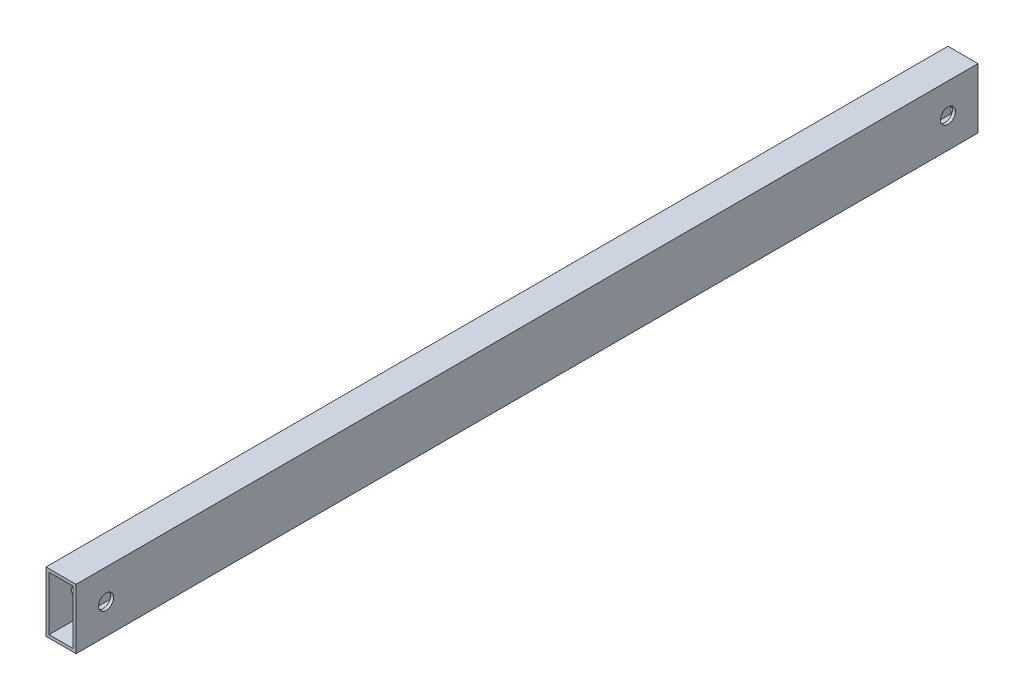
ISO-10303-21;
HEADER;
FILE_DESCRIPTION(('STEP AP214'),'2;1');
FILE_NAME('part.step','',(''),(''),'','','');
FILE_SCHEMA(('AUTOMOTIVE_DESIGN { 1 0 10303 214 1 1 1 1 }'));
ENDSEC;
DATA;
#1=APPLICATION_CONTEXT('core data for automotive mechanical design processes');
#2=APPLICATION_PROTOCOL_DEFINITION('international standard','automotive_design',2000,#1);
#3=PRODUCT_CONTEXT('',#1,'mechanical');
#4=PRODUCT('Part','Part','',(#3));
#5=PRODUCT_RELATED_PRODUCT_CATEGORY('part','',(#4));
#6=PRODUCT_DEFINITION_FORMATION('','',#4);
#7=PRODUCT_DEFINITION_CONTEXT('part definition',#1,'design');
#8=PRODUCT_DEFINITION('design','',#6,#7);
#9=PRODUCT_DEFINITION_SHAPE('','',#8);
#10=(LENGTH_UNIT() NAMED_UNIT(*) SI_UNIT(.MILLI.,.METRE.));
#11=(NAMED_UNIT(*) PLANE_ANGLE_UNIT() SI_UNIT($,.RADIAN.));
#12=(NAMED_UNIT(*) SI_UNIT($,.STERADIAN.) SOLID_ANGLE_UNIT());
#13=UNCERTAINTY_MEASURE_WITH_UNIT(LENGTH_MEASURE(1.E-05),#10,'distance_accuracy_value','');
#14=(GEOMETRIC_REPRESENTATION_CONTEXT(3) GLOBAL_UNCERTAINTY_ASSIGNED_CONTEXT((#13)) GLOBAL_UNIT_ASSIGNED_CONTEXT((#10,
#11,#12)) REPRESENTATION_CONTEXT('',''));
#15=CARTESIAN_POINT('',(0.,0.,0.));
#16=DIRECTION('',(0.,0.,1.));
#17=DIRECTION('',(1.,0.,0.));
#18=AXIS2_PLACEMENT_3D('',#15,#16,#17);
#19=CARTESIAN_POINT('',(0.,0.,300.));
#20=DIRECTION('',(0.,0.,-1.));
#21=DIRECTION('',(-1.,0.,0.));
#22=AXIS2_PLACEMENT_3D('',#19,#20,#21);
#23=PLANE('',#22);
#24=DIRECTION('',(0.,1.,0.));
#25=VECTOR('',#24,1.);
#26=CARTESIAN_POINT('',(5.00000000000001,-9.99999999999999,300.));
#27=LINE('',#26,#25);
#28=CARTESIAN_POINT('',(5.00000000000001,-9.99999999999999,300.));
#29=VERTEX_POINT('',#28);
#30=CARTESIAN_POINT('',(5.00000000000001,10.,300.));
#31=VERTEX_POINT('',#30);
#32=EDGE_CURVE('E142',#29,#31,#27,.T.);
#33=ORIENTED_EDGE('',*,*,#32,.T.);
#34=DIRECTION('',(-1.,0.,0.));
#35=VECTOR('',#34,1.);
#36=CARTESIAN_POINT('',(-4.99999999999999,10.,300.));
#37=LINE('',#36,#35);
#38=CARTESIAN_POINT('',(-4.99999999999999,10.,300.));
#39=VERTEX_POINT('',#38);
#40=EDGE_CURVE('E145',#31,#39,#37,.T.);
#41=ORIENTED_EDGE('',*,*,#40,.T.);
#42=DIRECTION('',(0.,-1.,0.));
#43=VECTOR('',#42,1.);
#44=CARTESIAN_POINT('',(-4.99999999999999,-9.99999999999999,300.));
#45=LINE('',#44,#43);
#46=CARTESIAN_POINT('',(-4.99999999999999,-9.99999999999999,300.));
#47=VERTEX_POINT('',#46);
#48=EDGE_CURVE('E148',#39,#47,#45,.T.);
#49=ORIENTED_EDGE('',*,*,#48,.T.);
#50=DIRECTION('',(1.,0.,0.));
#51=VECTOR('',#50,1.);
#52=CARTESIAN_POINT('',(-4.99999999999999,-9.99999999999999,300.));
#53=LINE('',#52,#51);
#54=EDGE_CURVE('E150',#47,#29,#53,.T.);
#55=ORIENTED_EDGE('',*,*,#54,.T.);
#56=EDGE_LOOP('',(#33,#41,#49,#55));
#57=FACE_BOUND('',#56,.T.);
#58=DIRECTION('',(0.,-1.,0.));
#59=VECTOR('',#58,1.);
#60=CARTESIAN_POINT('',(-3.99999999999999,-8.99999999999999,300.));
#61=LINE('',#60,#59);
#62=CARTESIAN_POINT('',(-3.99999999999999,9.00000000000001,300.));
#63=VERTEX_POINT('',#62);
#64=CARTESIAN_POINT('',(-3.99999999999999,-8.99999999999999,300.));
#65=VERTEX_POINT('',#64);
#66=EDGE_CURVE('E104',#63,#65,#61,.T.);
#67=ORIENTED_EDGE('',*,*,#66,.F.);
#68=DIRECTION('',(-1.,0.,0.));
#69=VECTOR('',#68,1.);
#70=CARTESIAN_POINT('',(-3.99999999999999,9.00000000000001,300.));
#71=LINE('',#70,#69);
#72=CARTESIAN_POINT('',(4.00000000000001,9.00000000000001,300.));
#73=VERTEX_POINT('',#72);
#74=EDGE_CURVE('E126',#73,#63,#71,.T.);
#75=ORIENTED_EDGE('',*,*,#74,.F.);
#76=DIRECTION('',(0.,1.,0.));
#77=VECTOR('',#76,1.);
#78=CARTESIAN_POINT('',(4.00000000000001,-8.99999999999999,300.));
#79=LINE('',#78,#77);
#80=CARTESIAN_POINT('',(4.00000000000001,-8.99999999999999,300.));
#81=VERTEX_POINT('',#80);
#82=EDGE_CURVE('E124',#81,#73,#79,.T.);
#83=ORIENTED_EDGE('',*,*,#82,.F.);
#84=DIRECTION('',(1.,0.,0.));
#85=VECTOR('',#84,1.);
#86=CARTESIAN_POINT('',(-3.99999999999999,-8.99999999999999,300.));
#87=LINE('',#86,#85);
#88=EDGE_CURVE('E112',#65,#81,#87,.T.);
#89=ORIENTED_EDGE('',*,*,#88,.F.);
#90=EDGE_LOOP('',(#67,#75,#83,#89));
#91=FACE_BOUND('',#90,.T.);
#92=ADVANCED_FACE('F37',(#57,#91),#23,.F.);
#93=CARTESIAN_POINT('',(0.,0.,0.));
#94=DIRECTION('',(0.,0.,-1.));
#95=DIRECTION('',(-1.,0.,0.));
#96=AXIS2_PLACEMENT_3D('',#93,#94,#95);
#97=PLANE('',#96);
#98=DIRECTION('',(0.,1.,0.));
#99=VECTOR('',#98,1.);
#100=CARTESIAN_POINT('',(5.00000000000001,-9.99999999999999,0.));
#101=LINE('',#100,#99);
#102=CARTESIAN_POINT('',(5.00000000000001,-9.99999999999999,0.));
#103=VERTEX_POINT('',#102);
#104=CARTESIAN_POINT('',(5.00000000000001,10.,0.));
#105=VERTEX_POINT('',#104);
#106=EDGE_CURVE('E120',#103,#105,#101,.T.);
#107=ORIENTED_EDGE('',*,*,#106,.F.);
#108=DIRECTION('',(1.,0.,0.));
#109=VECTOR('',#108,1.);
#110=CARTESIAN_POINT('',(-4.99999999999999,-9.99999999999999,0.));
#111=LINE('',#110,#109);
#112=CARTESIAN_POINT('',(-4.99999999999999,-9.99999999999999,0.));
#113=VERTEX_POINT('',#112);
#114=EDGE_CURVE('E146',#113,#103,#111,.T.);
#115=ORIENTED_EDGE('',*,*,#114,.F.);
#116=DIRECTION('',(0.,-1.,0.));
#117=VECTOR('',#116,1.);
#118=CARTESIAN_POINT('',(-4.99999999999999,-9.99999999999999,0.));
#119=LINE('',#118,#117);
#120=CARTESIAN_POINT('',(-4.99999999999999,10.,0.));
#121=VERTEX_POINT('',#120);
#122=EDGE_CURVE('E157',#121,#113,#119,.T.);
#123=ORIENTED_EDGE('',*,*,#122,.F.);
#124=DIRECTION('',(-1.,0.,0.));
#125=VECTOR('',#124,1.);
#126=CARTESIAN_POINT('',(-4.99999999999999,10.,0.));
#127=LINE('',#126,#125);
#128=EDGE_CURVE('E155',#105,#121,#127,.T.);
#129=ORIENTED_EDGE('',*,*,#128,.F.);
#130=EDGE_LOOP('',(#107,#115,#123,#129));
#131=FACE_BOUND('',#130,.T.);
#132=DIRECTION('',(-1.,0.,0.));
#133=VECTOR('',#132,1.);
#134=CARTESIAN_POINT('',(-3.99999999999999,9.00000000000001,0.));
#135=LINE('',#134,#133);
#136=CARTESIAN_POINT('',(4.00000000000001,9.00000000000001,0.));
#137=VERTEX_POINT('',#136);
#138=CARTESIAN_POINT('',(-3.99999999999999,9.00000000000001,0.));
#139=VERTEX_POINT('',#138);
#140=EDGE_CURVE('E113',#137,#139,#135,.T.);
#141=ORIENTED_EDGE('',*,*,#140,.T.);
#142=DIRECTION('',(0.,-1.,0.));
#143=VECTOR('',#142,1.);
#144=CARTESIAN_POINT('',(-3.99999999999999,-8.99999999999999,0.));
#145=LINE('',#144,#143);
#146=CARTESIAN_POINT('',(-3.99999999999999,-8.99999999999999,0.));
#147=VERTEX_POINT('',#146);
#148=EDGE_CURVE('E62',#139,#147,#145,.T.);
#149=ORIENTED_EDGE('',*,*,#148,.T.);
#150=DIRECTION('',(1.,0.,0.));
#151=VECTOR('',#150,1.);
#152=CARTESIAN_POINT('',(-3.99999999999999,-8.99999999999999,0.));
#153=LINE('',#152,#151);
#154=CARTESIAN_POINT('',(4.00000000000001,-8.99999999999999,0.));
#155=VERTEX_POINT('',#154);
#156=EDGE_CURVE('E119',#147,#155,#153,.T.);
#157=ORIENTED_EDGE('',*,*,#156,.T.);
#158=DIRECTION('',(0.,1.,0.));
#159=VECTOR('',#158,1.);
#160=CARTESIAN_POINT('',(4.00000000000001,-8.99999999999999,0.));
#161=LINE('',#160,#159);
#162=EDGE_CURVE('E134',#155,#137,#161,.T.);
#163=ORIENTED_EDGE('',*,*,#162,.T.);
#164=EDGE_LOOP('',(#141,#149,#157,#163));
#165=FACE_BOUND('',#164,.T.);
#166=ADVANCED_FACE('F204',(#131,#165),#97,.T.);
#167=CARTESIAN_POINT('',(5.00000000000001,-9.99999999999999,300.));
#168=DIRECTION('',(-1.,0.,0.));
#169=DIRECTION('',(0.,0.,1.));
#170=AXIS2_PLACEMENT_3D('',#167,#168,#169);
#171=PLANE('',#170);
#172=CARTESIAN_POINT('',(5.00000000000001,0.,9.99999999999995));
#173=DIRECTION('',(1.,0.,0.));
#174=DIRECTION('',(0.,0.,-1.));
#175=AXIS2_PLACEMENT_3D('',#172,#173,#174);
#176=CIRCLE('',#175,2.49999999999999);
#177=CARTESIAN_POINT('',(5.00000000000001,0.,7.49999999999996));
#178=VERTEX_POINT('',#177);
#179=EDGE_CURVE('E175',#178,#178,#176,.T.);
#180=ORIENTED_EDGE('',*,*,#179,.F.);
#181=EDGE_LOOP('',(#180));
#182=FACE_BOUND('',#181,.T.);
#183=CARTESIAN_POINT('',(5.00000000000001,0.,290.));
#184=DIRECTION('',(1.,0.,0.));
#185=DIRECTION('',(0.,0.,-1.));
#186=AXIS2_PLACEMENT_3D('',#183,#184,#185);
#187=CIRCLE('',#186,2.50000000000002);
#188=CARTESIAN_POINT('',(5.00000000000001,0.,287.5));
#189=VERTEX_POINT('',#188);
#190=EDGE_CURVE('E180',#189,#189,#187,.T.);
#191=ORIENTED_EDGE('',*,*,#190,.F.);
#192=EDGE_LOOP('',(#191));
#193=FACE_BOUND('',#192,.T.);
#194=ORIENTED_EDGE('',*,*,#106,.T.);
#195=DIRECTION('',(0.,0.,-1.));
#196=VECTOR('',#195,1.);
#197=CARTESIAN_POINT('',(5.00000000000001,10.,300.));
#198=LINE('',#197,#196);
#199=EDGE_CURVE('E11',#31,#105,#198,.T.);
#200=ORIENTED_EDGE('',*,*,#199,.F.);
#201=ORIENTED_EDGE('',*,*,#32,.F.);
#202=DIRECTION('',(0.,0.,-1.));
#203=VECTOR('',#202,1.);
#204=CARTESIAN_POINT('',(5.00000000000001,-9.99999999999999,300.));
#205=LINE('',#204,#203);
#206=EDGE_CURVE('E152',#29,#103,#205,.T.);
#207=ORIENTED_EDGE('',*,*,#206,.T.);
#208=EDGE_LOOP('',(#194,#200,#201,#207));
#209=FACE_BOUND('',#208,.T.);
#210=ADVANCED_FACE('F39',(#182,#193,#209),#171,.F.);
#211=CARTESIAN_POINT('',(-4.99999999999999,10.,300.));
#212=DIRECTION('',(0.,-1.,0.));
#213=DIRECTION('',(0.,0.,-1.));
#214=AXIS2_PLACEMENT_3D('',#211,#212,#213);
#215=PLANE('',#214);
#216=ORIENTED_EDGE('',*,*,#128,.T.);
#217=DIRECTION('',(0.,0.,-1.));
#218=VECTOR('',#217,1.);
#219=CARTESIAN_POINT('',(-4.99999999999999,10.,300.));
#220=LINE('',#219,#218);
#221=EDGE_CURVE('E46',#39,#121,#220,.T.);
#222=ORIENTED_EDGE('',*,*,#221,.F.);
#223=ORIENTED_EDGE('',*,*,#40,.F.);
#224=ORIENTED_EDGE('',*,*,#199,.T.);
#225=EDGE_LOOP('',(#216,#222,#223,#224));
#226=FACE_BOUND('',#225,.T.);
#227=ADVANCED_FACE('F230',(#226),#215,.F.);
#228=CARTESIAN_POINT('',(-4.99999999999999,-9.99999999999999,300.));
#229=DIRECTION('',(1.,0.,0.));
#230=DIRECTION('',(0.,0.,-1.));
#231=AXIS2_PLACEMENT_3D('',#228,#229,#230);
#232=PLANE('',#231);
#233=CARTESIAN_POINT('',(-4.99999999999999,0.,9.99999999999995));
#234=DIRECTION('',(1.,0.,0.));
#235=DIRECTION('',(0.,0.,-1.));
#236=AXIS2_PLACEMENT_3D('',#233,#234,#235);
#237=CIRCLE('',#236,2.49999999999999);
#238=CARTESIAN_POINT('',(-4.99999999999999,0.,7.49999999999996));
#239=VERTEX_POINT('',#238);
#240=EDGE_CURVE('E169',#239,#239,#237,.T.);
#241=ORIENTED_EDGE('',*,*,#240,.T.);
#242=EDGE_LOOP('',(#241));
#243=FACE_BOUND('',#242,.T.);
#244=CARTESIAN_POINT('',(-4.99999999999999,0.,290.));
#245=DIRECTION('',(1.,0.,0.));
#246=DIRECTION('',(0.,0.,-1.));
#247=AXIS2_PLACEMENT_3D('',#244,#245,#246);
#248=CIRCLE('',#247,2.50000000000002);
#249=CARTESIAN_POINT('',(-4.99999999999999,0.,287.5));
#250=VERTEX_POINT('',#249);
#251=EDGE_CURVE('E185',#250,#250,#248,.T.);
#252=ORIENTED_EDGE('',*,*,#251,.T.);
#253=EDGE_LOOP('',(#252));
#254=FACE_BOUND('',#253,.T.);
#255=ORIENTED_EDGE('',*,*,#122,.T.);
#256=DIRECTION('',(0.,0.,-1.));
#257=VECTOR('',#256,1.);
#258=CARTESIAN_POINT('',(-4.99999999999999,-9.99999999999999,300.));
#259=LINE('',#258,#257);
#260=EDGE_CURVE('E162',#47,#113,#259,.T.);
#261=ORIENTED_EDGE('',*,*,#260,.F.);
#262=ORIENTED_EDGE('',*,*,#48,.F.);
#263=ORIENTED_EDGE('',*,*,#221,.T.);
#264=EDGE_LOOP('',(#255,#261,#262,#263));
#265=FACE_BOUND('',#264,.T.);
#266=ADVANCED_FACE('F227',(#243,#254,#265),#232,.F.);
#267=CARTESIAN_POINT('',(-4.99999999999999,-9.99999999999999,300.));
#268=DIRECTION('',(0.,1.,0.));
#269=DIRECTION('',(0.,0.,1.));
#270=AXIS2_PLACEMENT_3D('',#267,#268,#269);
#271=PLANE('',#270);
#272=ORIENTED_EDGE('',*,*,#114,.T.);
#273=ORIENTED_EDGE('',*,*,#206,.F.);
#274=ORIENTED_EDGE('',*,*,#54,.F.);
#275=ORIENTED_EDGE('',*,*,#260,.T.);
#276=EDGE_LOOP('',(#272,#273,#274,#275));
#277=FACE_BOUND('',#276,.T.);
#278=ADVANCED_FACE('F224',(#277),#271,.F.);
#279=CARTESIAN_POINT('',(-3.99999999999999,-8.99999999999999,300.));
#280=DIRECTION('',(1.,0.,0.));
#281=DIRECTION('',(0.,0.,-1.));
#282=AXIS2_PLACEMENT_3D('',#279,#280,#281);
#283=PLANE('',#282);
#284=CARTESIAN_POINT('',(-3.99999999999999,0.,9.99999999999995));
#285=DIRECTION('',(1.,0.,0.));
#286=DIRECTION('',(0.,0.,-1.));
#287=AXIS2_PLACEMENT_3D('',#284,#285,#286);
#288=CIRCLE('',#287,2.49999999999999);
#289=CARTESIAN_POINT('',(-3.99999999999999,0.,7.49999999999996));
#290=VERTEX_POINT('',#289);
#291=EDGE_CURVE('E132',#290,#290,#288,.T.);
#292=ORIENTED_EDGE('',*,*,#291,.F.);
#293=EDGE_LOOP('',(#292));
#294=FACE_BOUND('',#293,.T.);
#295=CARTESIAN_POINT('',(-3.99999999999999,0.,290.));
#296=DIRECTION('',(1.,0.,0.));
#297=DIRECTION('',(0.,0.,-1.));
#298=AXIS2_PLACEMENT_3D('',#295,#296,#297);
#299=CIRCLE('',#298,2.50000000000002);
#300=CARTESIAN_POINT('',(-3.99999999999999,0.,287.5));
#301=VERTEX_POINT('',#300);
#302=EDGE_CURVE('E168',#301,#301,#299,.T.);
#303=ORIENTED_EDGE('',*,*,#302,.F.);
#304=EDGE_LOOP('',(#303));
#305=FACE_BOUND('',#304,.T.);
#306=ORIENTED_EDGE('',*,*,#148,.F.);
#307=DIRECTION('',(0.,0.,-1.));
#308=VECTOR('',#307,1.);
#309=CARTESIAN_POINT('',(-3.99999999999999,9.00000000000001,300.));
#310=LINE('',#309,#308);
#311=EDGE_CURVE('E108',#63,#139,#310,.T.);
#312=ORIENTED_EDGE('',*,*,#311,.F.);
#313=ORIENTED_EDGE('',*,*,#66,.T.);
#314=DIRECTION('',(0.,0.,-1.));
#315=VECTOR('',#314,1.);
#316=CARTESIAN_POINT('',(-3.99999999999999,-8.99999999999999,300.));
#317=LINE('',#316,#315);
#318=EDGE_CURVE('E107',#65,#147,#317,.T.);
#319=ORIENTED_EDGE('',*,*,#318,.T.);
#320=EDGE_LOOP('',(#306,#312,#313,#319));
#321=FACE_BOUND('',#320,.T.);
#322=ADVANCED_FACE('F106',(#294,#305,#321),#283,.T.);
#323=CARTESIAN_POINT('',(-3.99999999999999,-8.99999999999999,300.));
#324=DIRECTION('',(0.,1.,0.));
#325=DIRECTION('',(0.,0.,1.));
#326=AXIS2_PLACEMENT_3D('',#323,#324,#325);
#327=PLANE('',#326);
#328=ORIENTED_EDGE('',*,*,#156,.F.);
#329=ORIENTED_EDGE('',*,*,#318,.F.);
#330=ORIENTED_EDGE('',*,*,#88,.T.);
#331=DIRECTION('',(0.,0.,-1.));
#332=VECTOR('',#331,1.);
#333=CARTESIAN_POINT('',(4.00000000000001,-8.99999999999999,300.));
#334=LINE('',#333,#332);
#335=EDGE_CURVE('E121',#81,#155,#334,.T.);
#336=ORIENTED_EDGE('',*,*,#335,.T.);
#337=EDGE_LOOP('',(#328,#329,#330,#336));
#338=FACE_BOUND('',#337,.T.);
#339=ADVANCED_FACE('F116',(#338),#327,.T.);
#340=CARTESIAN_POINT('',(4.00000000000001,-8.99999999999999,300.));
#341=DIRECTION('',(-1.,0.,0.));
#342=DIRECTION('',(0.,0.,1.));
#343=AXIS2_PLACEMENT_3D('',#340,#341,#342);
#344=PLANE('',#343);
#345=CARTESIAN_POINT('',(4.00000000000001,0.,9.99999999999995));
#346=DIRECTION('',(-1.,0.,0.));
#347=DIRECTION('',(0.,0.,1.));
#348=AXIS2_PLACEMENT_3D('',#345,#346,#347);
#349=CIRCLE('',#348,2.49999999999999);
#350=CARTESIAN_POINT('',(4.00000000000001,0.,12.4999999999999));
#351=VERTEX_POINT('',#350);
#352=EDGE_CURVE('E41',#351,#351,#349,.T.);
#353=ORIENTED_EDGE('',*,*,#352,.F.);
#354=EDGE_LOOP('',(#353));
#355=FACE_BOUND('',#354,.T.);
#356=CARTESIAN_POINT('',(4.00000000000001,0.,290.));
#357=DIRECTION('',(-1.,0.,0.));
#358=DIRECTION('',(0.,0.,1.));
#359=AXIS2_PLACEMENT_3D('',#356,#357,#358);
#360=CIRCLE('',#359,2.50000000000002);
#361=CARTESIAN_POINT('',(4.00000000000001,0.,292.5));
#362=VERTEX_POINT('',#361);
#363=EDGE_CURVE('E166',#362,#362,#360,.T.);
#364=ORIENTED_EDGE('',*,*,#363,.F.);
#365=EDGE_LOOP('',(#364));
#366=FACE_BOUND('',#365,.T.);
#367=ORIENTED_EDGE('',*,*,#162,.F.);
#368=ORIENTED_EDGE('',*,*,#335,.F.);
#369=ORIENTED_EDGE('',*,*,#82,.T.);
#370=DIRECTION('',(0.,0.,-1.));
#371=VECTOR('',#370,1.);
#372=CARTESIAN_POINT('',(4.00000000000001,9.00000000000001,300.));
#373=LINE('',#372,#371);
#374=EDGE_CURVE('E54',#73,#137,#373,.T.);
#375=ORIENTED_EDGE('',*,*,#374,.T.);
#376=EDGE_LOOP('',(#367,#368,#369,#375));
#377=FACE_BOUND('',#376,.T.);
#378=ADVANCED_FACE('F196',(#355,#366,#377),#344,.T.);
#379=CARTESIAN_POINT('',(-3.99999999999999,9.00000000000001,300.));
#380=DIRECTION('',(0.,-1.,0.));
#381=DIRECTION('',(0.,0.,-1.));
#382=AXIS2_PLACEMENT_3D('',#379,#380,#381);
#383=PLANE('',#382);
#384=ORIENTED_EDGE('',*,*,#140,.F.);
#385=ORIENTED_EDGE('',*,*,#374,.F.);
#386=ORIENTED_EDGE('',*,*,#74,.T.);
#387=ORIENTED_EDGE('',*,*,#311,.T.);
#388=EDGE_LOOP('',(#384,#385,#386,#387));
#389=FACE_BOUND('',#388,.T.);
#390=ADVANCED_FACE('F199',(#389),#383,.T.);
#391=CARTESIAN_POINT('',(-4.99999999999999,0.,290.));
#392=DIRECTION('',(1.,0.,0.));
#393=DIRECTION('',(0.,0.,-1.));
#394=AXIS2_PLACEMENT_3D('',#391,#392,#393);
#395=CYLINDRICAL_SURFACE('',#394,2.50000000000002);
#396=ORIENTED_EDGE('',*,*,#363,.T.);
#397=EDGE_LOOP('',(#396));
#398=FACE_BOUND('',#397,.T.);
#399=ORIENTED_EDGE('',*,*,#190,.T.);
#400=EDGE_LOOP('',(#399));
#401=FACE_BOUND('',#400,.T.);
#402=ADVANCED_FACE('F206',(#398,#401),#395,.F.);
#403=CARTESIAN_POINT('',(-4.99999999999999,0.,9.99999999999995));
#404=DIRECTION('',(1.,0.,0.));
#405=DIRECTION('',(0.,0.,-1.));
#406=AXIS2_PLACEMENT_3D('',#403,#404,#405);
#407=CYLINDRICAL_SURFACE('',#406,2.49999999999999);
#408=ORIENTED_EDGE('',*,*,#352,.T.);
#409=EDGE_LOOP('',(#408));
#410=FACE_BOUND('',#409,.T.);
#411=ORIENTED_EDGE('',*,*,#179,.T.);
#412=EDGE_LOOP('',(#411));
#413=FACE_BOUND('',#412,.T.);
#414=ADVANCED_FACE('F193',(#410,#413),#407,.F.);
#415=ORIENTED_EDGE('',*,*,#302,.T.);
#416=EDGE_LOOP('',(#415));
#417=FACE_BOUND('',#416,.T.);
#418=ORIENTED_EDGE('',*,*,#251,.F.);
#419=EDGE_LOOP('',(#418));
#420=FACE_BOUND('',#419,.T.);
#421=ADVANCED_FACE('F212',(#417,#420),#395,.F.);
#422=ORIENTED_EDGE('',*,*,#291,.T.);
#423=EDGE_LOOP('',(#422));
#424=FACE_BOUND('',#423,.T.);
#425=ORIENTED_EDGE('',*,*,#240,.F.);
#426=EDGE_LOOP('',(#425));
#427=FACE_BOUND('',#426,.T.);
#428=ADVANCED_FACE('F257',(#424,#427),#407,.F.);
#429=CLOSED_SHELL('',(#92,#166,#210,#227,#266,#278,#322,#339,#378,#390,#402,#414,#421,#428));
#430=MANIFOLD_SOLID_BREP('B2',#429);
#431=ADVANCED_BREP_SHAPE_REPRESENTATION('',(#18,#430),#14);
#432=SHAPE_DEFINITION_REPRESENTATION(#9,#431);
ENDSEC;
END-ISO-10303-21;
